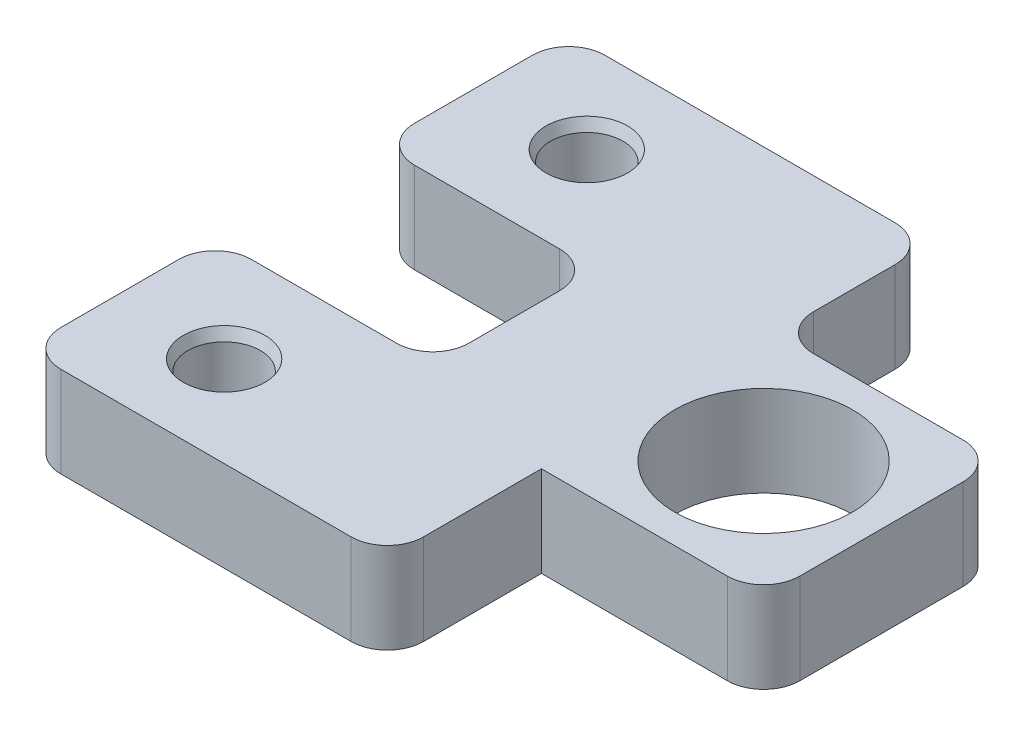
ISO-10303-21;
HEADER;
FILE_DESCRIPTION(('STEP AP214'),'2;1');
FILE_NAME('part.step','',(''),(''),'','','');
FILE_SCHEMA(('AUTOMOTIVE_DESIGN { 1 0 10303 214 1 1 1 1 }'));
ENDSEC;
DATA;
#1=APPLICATION_CONTEXT('core data for automotive mechanical design processes');
#2=APPLICATION_PROTOCOL_DEFINITION('international standard','automotive_design',2000,#1);
#3=PRODUCT_CONTEXT('',#1,'mechanical');
#4=PRODUCT('Part','Part','',(#3));
#5=PRODUCT_RELATED_PRODUCT_CATEGORY('part','',(#4));
#6=PRODUCT_DEFINITION_FORMATION('','',#4);
#7=PRODUCT_DEFINITION_CONTEXT('part definition',#1,'design');
#8=PRODUCT_DEFINITION('design','',#6,#7);
#9=PRODUCT_DEFINITION_SHAPE('','',#8);
#10=(LENGTH_UNIT() NAMED_UNIT(*) SI_UNIT(.MILLI.,.METRE.));
#11=(NAMED_UNIT(*) PLANE_ANGLE_UNIT() SI_UNIT($,.RADIAN.));
#12=(NAMED_UNIT(*) SI_UNIT($,.STERADIAN.) SOLID_ANGLE_UNIT());
#13=UNCERTAINTY_MEASURE_WITH_UNIT(LENGTH_MEASURE(1.E-05),#10,'distance_accuracy_value','');
#14=(GEOMETRIC_REPRESENTATION_CONTEXT(3) GLOBAL_UNCERTAINTY_ASSIGNED_CONTEXT((#13)) GLOBAL_UNIT_ASSIGNED_CONTEXT((#10,
#11,#12)) REPRESENTATION_CONTEXT('',''));
#15=CARTESIAN_POINT('',(0.,0.,0.));
#16=DIRECTION('',(0.,0.,1.));
#17=DIRECTION('',(1.,0.,0.));
#18=AXIS2_PLACEMENT_3D('',#15,#16,#17);
#19=CARTESIAN_POINT('',(10.,5.,0.));
#20=DIRECTION('',(-1.,0.,0.));
#21=DIRECTION('',(0.,0.,1.));
#22=AXIS2_PLACEMENT_3D('',#19,#20,#21);
#23=PLANE('',#22);
#24=DIRECTION('',(0.,0.,-1.));
#25=VECTOR('',#24,1.);
#26=CARTESIAN_POINT('',(10.,5.,0.));
#27=LINE('',#26,#25);
#28=CARTESIAN_POINT('',(10.,5.,13.));
#29=VERTEX_POINT('',#28);
#30=CARTESIAN_POINT('',(10.,5.,6.5));
#31=VERTEX_POINT('',#30);
#32=EDGE_CURVE('E196',#29,#31,#27,.T.);
#33=ORIENTED_EDGE('',*,*,#32,.F.);
#34=DIRECTION('',(0.,-1.,0.));
#35=VECTOR('',#34,1.);
#36=CARTESIAN_POINT('',(10.,5.,13.));
#37=LINE('',#36,#35);
#38=CARTESIAN_POINT('',(10.,0.,13.));
#39=VERTEX_POINT('',#38);
#40=EDGE_CURVE('E312',#29,#39,#37,.T.);
#41=ORIENTED_EDGE('',*,*,#40,.T.);
#42=DIRECTION('',(0.,0.,-1.));
#43=VECTOR('',#42,1.);
#44=CARTESIAN_POINT('',(10.,0.,0.));
#45=LINE('',#44,#43);
#46=CARTESIAN_POINT('',(10.,0.,6.5));
#47=VERTEX_POINT('',#46);
#48=EDGE_CURVE('E222',#39,#47,#45,.T.);
#49=ORIENTED_EDGE('',*,*,#48,.T.);
#50=DIRECTION('',(0.,-1.,0.));
#51=VECTOR('',#50,1.);
#52=CARTESIAN_POINT('',(10.,5.,6.5));
#53=LINE('',#52,#51);
#54=EDGE_CURVE('E216',#31,#47,#53,.T.);
#55=ORIENTED_EDGE('',*,*,#54,.F.);
#56=EDGE_LOOP('',(#33,#41,#49,#55));
#57=FACE_BOUND('',#56,.T.);
#58=ADVANCED_FACE('F41',(#57),#23,.F.);
#59=CARTESIAN_POINT('',(0.,5.,6.5));
#60=DIRECTION('',(0.,0.,-1.));
#61=DIRECTION('',(-1.,0.,0.));
#62=AXIS2_PLACEMENT_3D('',#59,#60,#61);
#63=PLANE('',#62);
#64=DIRECTION('',(1.,0.,0.));
#65=VECTOR('',#64,1.);
#66=CARTESIAN_POINT('',(0.,0.,6.5));
#67=LINE('',#66,#65);
#68=CARTESIAN_POINT('',(20.25,0.,6.5));
#69=VERTEX_POINT('',#68);
#70=EDGE_CURVE('E362',#47,#69,#67,.T.);
#71=ORIENTED_EDGE('',*,*,#70,.T.);
#72=DIRECTION('',(0.,-1.,0.));
#73=VECTOR('',#72,1.);
#74=CARTESIAN_POINT('',(20.25,5.,6.5));
#75=LINE('',#74,#73);
#76=CARTESIAN_POINT('',(20.25,5.,6.5));
#77=VERTEX_POINT('',#76);
#78=EDGE_CURVE('E218',#69,#77,#75,.F.);
#79=ORIENTED_EDGE('',*,*,#78,.T.);
#80=DIRECTION('',(1.,0.,0.));
#81=VECTOR('',#80,1.);
#82=CARTESIAN_POINT('',(0.,5.,6.5));
#83=LINE('',#82,#81);
#84=EDGE_CURVE('E201',#31,#77,#83,.T.);
#85=ORIENTED_EDGE('',*,*,#84,.F.);
#86=ORIENTED_EDGE('',*,*,#54,.T.);
#87=EDGE_LOOP('',(#71,#79,#85,#86));
#88=FACE_BOUND('',#87,.T.);
#89=ADVANCED_FACE('F215',(#88),#63,.F.);
#90=CARTESIAN_POINT('',(22.25,5.,0.));
#91=DIRECTION('',(-1.,0.,0.));
#92=DIRECTION('',(0.,0.,1.));
#93=AXIS2_PLACEMENT_3D('',#90,#91,#92);
#94=PLANE('',#93);
#95=DIRECTION('',(0.,0.,-1.));
#96=VECTOR('',#95,1.);
#97=CARTESIAN_POINT('',(22.25,0.,0.));
#98=LINE('',#97,#96);
#99=CARTESIAN_POINT('',(22.25,0.,4.5));
#100=VERTEX_POINT('',#99);
#101=CARTESIAN_POINT('',(22.25,0.,-4.5));
#102=VERTEX_POINT('',#101);
#103=EDGE_CURVE('E366',#100,#102,#98,.T.);
#104=ORIENTED_EDGE('',*,*,#103,.T.);
#105=DIRECTION('',(0.,-1.,0.));
#106=VECTOR('',#105,1.);
#107=CARTESIAN_POINT('',(22.25,5.,-4.5));
#108=LINE('',#107,#106);
#109=CARTESIAN_POINT('',(22.25,5.,-4.5));
#110=VERTEX_POINT('',#109);
#111=EDGE_CURVE('E309',#102,#110,#108,.F.);
#112=ORIENTED_EDGE('',*,*,#111,.T.);
#113=DIRECTION('',(0.,0.,-1.));
#114=VECTOR('',#113,1.);
#115=CARTESIAN_POINT('',(22.25,5.,0.));
#116=LINE('',#115,#114);
#117=CARTESIAN_POINT('',(22.25,5.,4.5));
#118=VERTEX_POINT('',#117);
#119=EDGE_CURVE('E219',#118,#110,#116,.T.);
#120=ORIENTED_EDGE('',*,*,#119,.F.);
#121=DIRECTION('',(0.,-1.,0.));
#122=VECTOR('',#121,1.);
#123=CARTESIAN_POINT('',(22.25,5.,4.5));
#124=LINE('',#123,#122);
#125=EDGE_CURVE('E306',#118,#100,#124,.T.);
#126=ORIENTED_EDGE('',*,*,#125,.T.);
#127=EDGE_LOOP('',(#104,#112,#120,#126));
#128=FACE_BOUND('',#127,.T.);
#129=ADVANCED_FACE('F414',(#128),#94,.F.);
#130=CARTESIAN_POINT('',(0.,5.,-6.5));
#131=DIRECTION('',(0.,0.,-1.));
#132=DIRECTION('',(-1.,0.,0.));
#133=AXIS2_PLACEMENT_3D('',#130,#131,#132);
#134=PLANE('',#133);
#135=DIRECTION('',(1.,0.,0.));
#136=VECTOR('',#135,1.);
#137=CARTESIAN_POINT('',(0.,0.,-6.5));
#138=LINE('',#137,#136);
#139=CARTESIAN_POINT('',(12.,0.,-6.5));
#140=VERTEX_POINT('',#139);
#141=CARTESIAN_POINT('',(20.25,0.,-6.5));
#142=VERTEX_POINT('',#141);
#143=EDGE_CURVE('E369',#140,#142,#138,.T.);
#144=ORIENTED_EDGE('',*,*,#143,.F.);
#145=DIRECTION('',(0.,-1.,0.));
#146=VECTOR('',#145,1.);
#147=CARTESIAN_POINT('',(12.,5.,-6.5));
#148=LINE('',#147,#146);
#149=CARTESIAN_POINT('',(12.,5.,-6.5));
#150=VERTEX_POINT('',#149);
#151=EDGE_CURVE('E240',#140,#150,#148,.F.);
#152=ORIENTED_EDGE('',*,*,#151,.T.);
#153=DIRECTION('',(1.,0.,0.));
#154=VECTOR('',#153,1.);
#155=CARTESIAN_POINT('',(0.,5.,-6.5));
#156=LINE('',#155,#154);
#157=CARTESIAN_POINT('',(20.25,5.,-6.5));
#158=VERTEX_POINT('',#157);
#159=EDGE_CURVE('E436',#150,#158,#156,.T.);
#160=ORIENTED_EDGE('',*,*,#159,.T.);
#161=DIRECTION('',(0.,-1.,0.));
#162=VECTOR('',#161,1.);
#163=CARTESIAN_POINT('',(20.25,0.,-6.5));
#164=LINE('',#163,#162);
#165=EDGE_CURVE('E237',#158,#142,#164,.T.);
#166=ORIENTED_EDGE('',*,*,#165,.T.);
#167=EDGE_LOOP('',(#144,#152,#160,#166));
#168=FACE_BOUND('',#167,.T.);
#169=ADVANCED_FACE('F420',(#168),#134,.T.);
#170=CARTESIAN_POINT('',(10.,5.,-8.5));
#171=VERTEX_POINT('',#170);
#172=CARTESIAN_POINT('',(10.,5.,-13.));
#173=VERTEX_POINT('',#172);
#174=EDGE_CURVE('E211',#171,#173,#27,.T.);
#175=ORIENTED_EDGE('',*,*,#174,.F.);
#176=DIRECTION('',(0.,-1.,0.));
#177=VECTOR('',#176,1.);
#178=CARTESIAN_POINT('',(10.,5.,-8.5));
#179=LINE('',#178,#177);
#180=CARTESIAN_POINT('',(10.,0.,-8.5));
#181=VERTEX_POINT('',#180);
#182=EDGE_CURVE('E227',#171,#181,#179,.T.);
#183=ORIENTED_EDGE('',*,*,#182,.T.);
#184=CARTESIAN_POINT('',(10.,0.,-13.));
#185=VERTEX_POINT('',#184);
#186=EDGE_CURVE('E364',#181,#185,#45,.T.);
#187=ORIENTED_EDGE('',*,*,#186,.T.);
#188=DIRECTION('',(0.,-1.,0.));
#189=VECTOR('',#188,1.);
#190=CARTESIAN_POINT('',(10.,5.,-13.));
#191=LINE('',#190,#189);
#192=EDGE_CURVE('E224',#185,#173,#191,.F.);
#193=ORIENTED_EDGE('',*,*,#192,.T.);
#194=EDGE_LOOP('',(#175,#183,#187,#193));
#195=FACE_BOUND('',#194,.T.);
#196=ADVANCED_FACE('F409',(#195),#23,.F.);
#197=CARTESIAN_POINT('',(0.,5.,-15.));
#198=DIRECTION('',(0.,0.,-1.));
#199=DIRECTION('',(-1.,0.,0.));
#200=AXIS2_PLACEMENT_3D('',#197,#198,#199);
#201=PLANE('',#200);
#202=DIRECTION('',(1.,0.,0.));
#203=VECTOR('',#202,1.);
#204=CARTESIAN_POINT('',(0.,5.,-15.));
#205=LINE('',#204,#203);
#206=CARTESIAN_POINT('',(-7.99999999999999,5.,-15.));
#207=VERTEX_POINT('',#206);
#208=CARTESIAN_POINT('',(8.00000000000001,5.,-15.));
#209=VERTEX_POINT('',#208);
#210=EDGE_CURVE('E435',#207,#209,#205,.T.);
#211=ORIENTED_EDGE('',*,*,#210,.T.);
#212=DIRECTION('',(0.,-1.,0.));
#213=VECTOR('',#212,1.);
#214=CARTESIAN_POINT('',(8.00000000000001,0.,-15.));
#215=LINE('',#214,#213);
#216=CARTESIAN_POINT('',(8.00000000000001,0.,-15.));
#217=VERTEX_POINT('',#216);
#218=EDGE_CURVE('E244',#209,#217,#215,.T.);
#219=ORIENTED_EDGE('',*,*,#218,.T.);
#220=DIRECTION('',(1.,0.,0.));
#221=VECTOR('',#220,1.);
#222=CARTESIAN_POINT('',(0.,0.,-15.));
#223=LINE('',#222,#221);
#224=CARTESIAN_POINT('',(-7.99999999999999,0.,-15.));
#225=VERTEX_POINT('',#224);
#226=EDGE_CURVE('E372',#225,#217,#223,.T.);
#227=ORIENTED_EDGE('',*,*,#226,.F.);
#228=DIRECTION('',(0.,-1.,0.));
#229=VECTOR('',#228,1.);
#230=CARTESIAN_POINT('',(-7.99999999999999,5.,-15.));
#231=LINE('',#230,#229);
#232=EDGE_CURVE('E242',#225,#207,#231,.F.);
#233=ORIENTED_EDGE('',*,*,#232,.T.);
#234=EDGE_LOOP('',(#211,#219,#227,#233));
#235=FACE_BOUND('',#234,.T.);
#236=ADVANCED_FACE('F419',(#235),#201,.T.);
#237=CARTESIAN_POINT('',(-9.99999999999999,5.,0.));
#238=DIRECTION('',(-1.,0.,0.));
#239=DIRECTION('',(0.,0.,1.));
#240=AXIS2_PLACEMENT_3D('',#237,#238,#239);
#241=PLANE('',#240);
#242=DIRECTION('',(0.,0.,-1.));
#243=VECTOR('',#242,1.);
#244=CARTESIAN_POINT('',(-9.99999999999999,5.,0.));
#245=LINE('',#244,#243);
#246=CARTESIAN_POINT('',(-9.99999999999999,5.,-6.5));
#247=VERTEX_POINT('',#246);
#248=CARTESIAN_POINT('',(-9.99999999999999,5.,-13.));
#249=VERTEX_POINT('',#248);
#250=EDGE_CURVE('E355',#247,#249,#245,.T.);
#251=ORIENTED_EDGE('',*,*,#250,.T.);
#252=DIRECTION('',(0.,-1.,0.));
#253=VECTOR('',#252,1.);
#254=CARTESIAN_POINT('',(-9.99999999999999,5.,-13.));
#255=LINE('',#254,#253);
#256=CARTESIAN_POINT('',(-9.99999999999999,0.,-13.));
#257=VERTEX_POINT('',#256);
#258=EDGE_CURVE('E279',#249,#257,#255,.T.);
#259=ORIENTED_EDGE('',*,*,#258,.T.);
#260=DIRECTION('',(0.,0.,-1.));
#261=VECTOR('',#260,1.);
#262=CARTESIAN_POINT('',(-9.99999999999999,0.,0.));
#263=LINE('',#262,#261);
#264=CARTESIAN_POINT('',(-9.99999999999999,0.,-6.5));
#265=VERTEX_POINT('',#264);
#266=EDGE_CURVE('E374',#265,#257,#263,.T.);
#267=ORIENTED_EDGE('',*,*,#266,.F.);
#268=DIRECTION('',(0.,-1.,0.));
#269=VECTOR('',#268,1.);
#270=CARTESIAN_POINT('',(-9.99999999999999,5.,-6.5));
#271=LINE('',#270,#269);
#272=EDGE_CURVE('E277',#265,#247,#271,.F.);
#273=ORIENTED_EDGE('',*,*,#272,.T.);
#274=EDGE_LOOP('',(#251,#259,#267,#273));
#275=FACE_BOUND('',#274,.T.);
#276=ADVANCED_FACE('F426',(#275),#241,.T.);
#277=CARTESIAN_POINT('',(0.,5.,-4.5));
#278=DIRECTION('',(0.,0.,-1.));
#279=DIRECTION('',(-1.,0.,0.));
#280=AXIS2_PLACEMENT_3D('',#277,#278,#279);
#281=PLANE('',#280);
#282=DIRECTION('',(1.,0.,0.));
#283=VECTOR('',#282,1.);
#284=CARTESIAN_POINT('',(0.,5.,-4.5));
#285=LINE('',#284,#283);
#286=CARTESIAN_POINT('',(-7.99999999999999,5.,-4.5));
#287=VERTEX_POINT('',#286);
#288=CARTESIAN_POINT('',(0.,5.,-4.5));
#289=VERTEX_POINT('',#288);
#290=EDGE_CURVE('E356',#287,#289,#285,.T.);
#291=ORIENTED_EDGE('',*,*,#290,.F.);
#292=DIRECTION('',(0.,-1.,0.));
#293=VECTOR('',#292,1.);
#294=CARTESIAN_POINT('',(-7.99999999999999,0.,-4.5));
#295=LINE('',#294,#293);
#296=CARTESIAN_POINT('',(-7.99999999999999,0.,-4.5));
#297=VERTEX_POINT('',#296);
#298=EDGE_CURVE('E284',#287,#297,#295,.T.);
#299=ORIENTED_EDGE('',*,*,#298,.T.);
#300=DIRECTION('',(1.,0.,0.));
#301=VECTOR('',#300,1.);
#302=CARTESIAN_POINT('',(0.,0.,-4.5));
#303=LINE('',#302,#301);
#304=CARTESIAN_POINT('',(0.,0.,-4.5));
#305=VERTEX_POINT('',#304);
#306=EDGE_CURVE('E339',#297,#305,#303,.T.);
#307=ORIENTED_EDGE('',*,*,#306,.T.);
#308=DIRECTION('',(0.,-1.,0.));
#309=VECTOR('',#308,1.);
#310=CARTESIAN_POINT('',(0.,5.,-4.5));
#311=LINE('',#310,#309);
#312=EDGE_CURVE('E282',#305,#289,#311,.F.);
#313=ORIENTED_EDGE('',*,*,#312,.T.);
#314=EDGE_LOOP('',(#291,#299,#307,#313));
#315=FACE_BOUND('',#314,.T.);
#316=ADVANCED_FACE('F573',(#315),#281,.F.);
#317=CARTESIAN_POINT('',(2.00000000000001,5.,0.));
#318=DIRECTION('',(1.,0.,0.));
#319=DIRECTION('',(0.,0.,-1.));
#320=AXIS2_PLACEMENT_3D('',#317,#318,#319);
#321=PLANE('',#320);
#322=DIRECTION('',(0.,0.,1.));
#323=VECTOR('',#322,1.);
#324=CARTESIAN_POINT('',(2.00000000000001,5.,0.));
#325=LINE('',#324,#323);
#326=CARTESIAN_POINT('',(2.00000000000001,5.,-2.5));
#327=VERTEX_POINT('',#326);
#328=CARTESIAN_POINT('',(2.00000000000001,5.,2.5));
#329=VERTEX_POINT('',#328);
#330=EDGE_CURVE('E347',#327,#329,#325,.T.);
#331=ORIENTED_EDGE('',*,*,#330,.F.);
#332=DIRECTION('',(0.,-1.,0.));
#333=VECTOR('',#332,1.);
#334=CARTESIAN_POINT('',(2.00000000000001,0.,-2.5));
#335=LINE('',#334,#333);
#336=CARTESIAN_POINT('',(2.00000000000001,0.,-2.5));
#337=VERTEX_POINT('',#336);
#338=EDGE_CURVE('E289',#327,#337,#335,.T.);
#339=ORIENTED_EDGE('',*,*,#338,.T.);
#340=DIRECTION('',(0.,0.,1.));
#341=VECTOR('',#340,1.);
#342=CARTESIAN_POINT('',(2.00000000000001,0.,0.));
#343=LINE('',#342,#341);
#344=CARTESIAN_POINT('',(2.00000000000001,0.,2.5));
#345=VERTEX_POINT('',#344);
#346=EDGE_CURVE('E328',#337,#345,#343,.T.);
#347=ORIENTED_EDGE('',*,*,#346,.T.);
#348=DIRECTION('',(0.,-1.,0.));
#349=VECTOR('',#348,1.);
#350=CARTESIAN_POINT('',(2.00000000000001,5.,2.5));
#351=LINE('',#350,#349);
#352=EDGE_CURVE('E287',#345,#329,#351,.F.);
#353=ORIENTED_EDGE('',*,*,#352,.T.);
#354=EDGE_LOOP('',(#331,#339,#347,#353));
#355=FACE_BOUND('',#354,.T.);
#356=ADVANCED_FACE('F336',(#355),#321,.F.);
#357=CARTESIAN_POINT('',(0.,5.,4.5));
#358=DIRECTION('',(0.,0.,1.));
#359=DIRECTION('',(1.,0.,0.));
#360=AXIS2_PLACEMENT_3D('',#357,#358,#359);
#361=PLANE('',#360);
#362=DIRECTION('',(-1.,0.,0.));
#363=VECTOR('',#362,1.);
#364=CARTESIAN_POINT('',(0.,5.,4.5));
#365=LINE('',#364,#363);
#366=CARTESIAN_POINT('',(0.,5.,4.5));
#367=VERTEX_POINT('',#366);
#368=CARTESIAN_POINT('',(-7.99999999999999,5.,4.5));
#369=VERTEX_POINT('',#368);
#370=EDGE_CURVE('E345',#367,#369,#365,.T.);
#371=ORIENTED_EDGE('',*,*,#370,.F.);
#372=DIRECTION('',(0.,-1.,0.));
#373=VECTOR('',#372,1.);
#374=CARTESIAN_POINT('',(0.,0.,4.5));
#375=LINE('',#374,#373);
#376=CARTESIAN_POINT('',(0.,0.,4.5));
#377=VERTEX_POINT('',#376);
#378=EDGE_CURVE('E294',#367,#377,#375,.T.);
#379=ORIENTED_EDGE('',*,*,#378,.T.);
#380=DIRECTION('',(-1.,0.,0.));
#381=VECTOR('',#380,1.);
#382=CARTESIAN_POINT('',(0.,0.,4.5));
#383=LINE('',#382,#381);
#384=CARTESIAN_POINT('',(-7.99999999999999,0.,4.5));
#385=VERTEX_POINT('',#384);
#386=EDGE_CURVE('E330',#377,#385,#383,.T.);
#387=ORIENTED_EDGE('',*,*,#386,.T.);
#388=DIRECTION('',(0.,-1.,0.));
#389=VECTOR('',#388,1.);
#390=CARTESIAN_POINT('',(-7.99999999999999,5.,4.5));
#391=LINE('',#390,#389);
#392=EDGE_CURVE('E292',#385,#369,#391,.F.);
#393=ORIENTED_EDGE('',*,*,#392,.T.);
#394=EDGE_LOOP('',(#371,#379,#387,#393));
#395=FACE_BOUND('',#394,.T.);
#396=ADVANCED_FACE('F349',(#395),#361,.F.);
#397=CARTESIAN_POINT('',(-9.99999999999999,5.,13.));
#398=VERTEX_POINT('',#397);
#399=CARTESIAN_POINT('',(-9.99999999999999,5.,6.5));
#400=VERTEX_POINT('',#399);
#401=EDGE_CURVE('E351',#398,#400,#245,.T.);
#402=ORIENTED_EDGE('',*,*,#401,.T.);
#403=DIRECTION('',(0.,-1.,0.));
#404=VECTOR('',#403,1.);
#405=CARTESIAN_POINT('',(-9.99999999999999,0.,6.5));
#406=LINE('',#405,#404);
#407=CARTESIAN_POINT('',(-9.99999999999999,0.,6.5));
#408=VERTEX_POINT('',#407);
#409=EDGE_CURVE('E299',#400,#408,#406,.T.);
#410=ORIENTED_EDGE('',*,*,#409,.T.);
#411=CARTESIAN_POINT('',(-9.99999999999999,0.,13.));
#412=VERTEX_POINT('',#411);
#413=EDGE_CURVE('E377',#412,#408,#263,.T.);
#414=ORIENTED_EDGE('',*,*,#413,.F.);
#415=DIRECTION('',(0.,-1.,0.));
#416=VECTOR('',#415,1.);
#417=CARTESIAN_POINT('',(-9.99999999999999,5.,13.));
#418=LINE('',#417,#416);
#419=EDGE_CURVE('E297',#412,#398,#418,.F.);
#420=ORIENTED_EDGE('',*,*,#419,.T.);
#421=EDGE_LOOP('',(#402,#410,#414,#420));
#422=FACE_BOUND('',#421,.T.);
#423=ADVANCED_FACE('F387',(#422),#241,.T.);
#424=CARTESIAN_POINT('',(0.,5.,15.));
#425=DIRECTION('',(0.,0.,-1.));
#426=DIRECTION('',(-1.,0.,0.));
#427=AXIS2_PLACEMENT_3D('',#424,#425,#426);
#428=PLANE('',#427);
#429=DIRECTION('',(1.,0.,0.));
#430=VECTOR('',#429,1.);
#431=CARTESIAN_POINT('',(0.,5.,15.));
#432=LINE('',#431,#430);
#433=CARTESIAN_POINT('',(-7.99999999999999,5.,15.));
#434=VERTEX_POINT('',#433);
#435=CARTESIAN_POINT('',(8.00000000000001,5.,15.));
#436=VERTEX_POINT('',#435);
#437=EDGE_CURVE('E230',#434,#436,#432,.T.);
#438=ORIENTED_EDGE('',*,*,#437,.F.);
#439=DIRECTION('',(0.,-1.,0.));
#440=VECTOR('',#439,1.);
#441=CARTESIAN_POINT('',(-7.99999999999999,0.,15.));
#442=LINE('',#441,#440);
#443=CARTESIAN_POINT('',(-7.99999999999999,0.,15.));
#444=VERTEX_POINT('',#443);
#445=EDGE_CURVE('E303',#434,#444,#442,.T.);
#446=ORIENTED_EDGE('',*,*,#445,.T.);
#447=DIRECTION('',(1.,0.,0.));
#448=VECTOR('',#447,1.);
#449=CARTESIAN_POINT('',(0.,0.,15.));
#450=LINE('',#449,#448);
#451=CARTESIAN_POINT('',(8.00000000000001,0.,15.));
#452=VERTEX_POINT('',#451);
#453=EDGE_CURVE('E380',#444,#452,#450,.T.);
#454=ORIENTED_EDGE('',*,*,#453,.T.);
#455=DIRECTION('',(0.,-1.,0.));
#456=VECTOR('',#455,1.);
#457=CARTESIAN_POINT('',(8.00000000000001,5.,15.));
#458=LINE('',#457,#456);
#459=EDGE_CURVE('E56',#452,#436,#458,.F.);
#460=ORIENTED_EDGE('',*,*,#459,.T.);
#461=EDGE_LOOP('',(#438,#446,#454,#460));
#462=FACE_BOUND('',#461,.T.);
#463=ADVANCED_FACE('F392',(#462),#428,.F.);
#464=CARTESIAN_POINT('',(15.75,5.,0.));
#465=DIRECTION('',(0.,-1.,0.));
#466=DIRECTION('',(0.,0.,-1.));
#467=AXIS2_PLACEMENT_3D('',#464,#465,#466);
#468=CYLINDRICAL_SURFACE('',#467,4.9);
#469=CARTESIAN_POINT('',(15.75,5.,0.));
#470=DIRECTION('',(0.,1.,0.));
#471=DIRECTION('',(0.,0.,1.));
#472=AXIS2_PLACEMENT_3D('',#469,#470,#471);
#473=CIRCLE('',#472,4.9);
#474=CARTESIAN_POINT('',(15.75,5.,4.9));
#475=VERTEX_POINT('',#474);
#476=EDGE_CURVE('E225',#475,#475,#473,.T.);
#477=ORIENTED_EDGE('',*,*,#476,.T.);
#478=EDGE_LOOP('',(#477));
#479=FACE_BOUND('',#478,.T.);
#480=CARTESIAN_POINT('',(15.75,0.,0.));
#481=DIRECTION('',(0.,1.,0.));
#482=DIRECTION('',(0.,0.,1.));
#483=AXIS2_PLACEMENT_3D('',#480,#481,#482);
#484=CIRCLE('',#483,4.9);
#485=CARTESIAN_POINT('',(15.75,0.,4.9));
#486=VERTEX_POINT('',#485);
#487=EDGE_CURVE('E209',#486,#486,#484,.T.);
#488=ORIENTED_EDGE('',*,*,#487,.F.);
#489=EDGE_LOOP('',(#488));
#490=FACE_BOUND('',#489,.T.);
#491=ADVANCED_FACE('F559',(#479,#490),#468,.F.);
#492=CARTESIAN_POINT('',(0.,5.,0.));
#493=DIRECTION('',(0.,1.,0.));
#494=DIRECTION('',(0.,0.,1.));
#495=AXIS2_PLACEMENT_3D('',#492,#493,#494);
#496=PLANE('',#495);
#497=CARTESIAN_POINT('',(-4.,5.,10.));
#498=DIRECTION('',(0.,1.,0.));
#499=DIRECTION('',(0.,0.,1.));
#500=AXIS2_PLACEMENT_3D('',#497,#498,#499);
#501=CIRCLE('',#500,2.25);
#502=CARTESIAN_POINT('',(-4.,5.,12.25));
#503=VERTEX_POINT('',#502);
#504=EDGE_CURVE('E740',#503,#503,#501,.T.);
#505=ORIENTED_EDGE('',*,*,#504,.F.);
#506=EDGE_LOOP('',(#505));
#507=FACE_BOUND('',#506,.T.);
#508=CARTESIAN_POINT('',(-4.00000000000001,5.,-10.));
#509=DIRECTION('',(0.,1.,0.));
#510=DIRECTION('',(0.,0.,1.));
#511=AXIS2_PLACEMENT_3D('',#508,#509,#510);
#512=CIRCLE('',#511,2.25);
#513=CARTESIAN_POINT('',(-4.00000000000001,5.,-7.75));
#514=VERTEX_POINT('',#513);
#515=EDGE_CURVE('E731',#514,#514,#512,.T.);
#516=ORIENTED_EDGE('',*,*,#515,.F.);
#517=EDGE_LOOP('',(#516));
#518=FACE_BOUND('',#517,.T.);
#519=ORIENTED_EDGE('',*,*,#174,.T.);
#520=CARTESIAN_POINT('',(8.00000000000001,5.,-13.));
#521=DIRECTION('',(0.,1.,0.));
#522=DIRECTION('',(0.,0.,1.));
#523=AXIS2_PLACEMENT_3D('',#520,#521,#522);
#524=CIRCLE('',#523,2.);
#525=EDGE_CURVE('E275',#173,#209,#524,.T.);
#526=ORIENTED_EDGE('',*,*,#525,.T.);
#527=ORIENTED_EDGE('',*,*,#210,.F.);
#528=CARTESIAN_POINT('',(-7.99999999999999,5.,-13.));
#529=DIRECTION('',(0.,1.,0.));
#530=DIRECTION('',(0.,0.,1.));
#531=AXIS2_PLACEMENT_3D('',#528,#529,#530);
#532=CIRCLE('',#531,2.);
#533=EDGE_CURVE('E273',#207,#249,#532,.T.);
#534=ORIENTED_EDGE('',*,*,#533,.T.);
#535=ORIENTED_EDGE('',*,*,#250,.F.);
#536=CARTESIAN_POINT('',(-7.99999999999999,5.,-6.5));
#537=DIRECTION('',(0.,1.,0.));
#538=DIRECTION('',(0.,0.,1.));
#539=AXIS2_PLACEMENT_3D('',#536,#537,#538);
#540=CIRCLE('',#539,2.);
#541=EDGE_CURVE('E271',#247,#287,#540,.T.);
#542=ORIENTED_EDGE('',*,*,#541,.T.);
#543=ORIENTED_EDGE('',*,*,#290,.T.);
#544=CARTESIAN_POINT('',(0.,5.,-2.5));
#545=DIRECTION('',(0.,1.,0.));
#546=DIRECTION('',(0.,0.,1.));
#547=AXIS2_PLACEMENT_3D('',#544,#545,#546);
#548=CIRCLE('',#547,2.);
#549=EDGE_CURVE('E320',#289,#327,#548,.F.);
#550=ORIENTED_EDGE('',*,*,#549,.T.);
#551=ORIENTED_EDGE('',*,*,#330,.T.);
#552=CARTESIAN_POINT('',(0.,5.,2.5));
#553=DIRECTION('',(0.,1.,0.));
#554=DIRECTION('',(0.,0.,1.));
#555=AXIS2_PLACEMENT_3D('',#552,#553,#554);
#556=CIRCLE('',#555,2.);
#557=EDGE_CURVE('E11',#329,#367,#556,.F.);
#558=ORIENTED_EDGE('',*,*,#557,.T.);
#559=ORIENTED_EDGE('',*,*,#370,.T.);
#560=CARTESIAN_POINT('',(-7.99999999999999,5.,6.5));
#561=DIRECTION('',(0.,1.,0.));
#562=DIRECTION('',(0.,0.,1.));
#563=AXIS2_PLACEMENT_3D('',#560,#561,#562);
#564=CIRCLE('',#563,2.);
#565=EDGE_CURVE('E269',#369,#400,#564,.T.);
#566=ORIENTED_EDGE('',*,*,#565,.T.);
#567=ORIENTED_EDGE('',*,*,#401,.F.);
#568=CARTESIAN_POINT('',(-7.99999999999999,5.,13.));
#569=DIRECTION('',(0.,1.,0.));
#570=DIRECTION('',(0.,0.,1.));
#571=AXIS2_PLACEMENT_3D('',#568,#569,#570);
#572=CIRCLE('',#571,2.);
#573=EDGE_CURVE('E63',#398,#434,#572,.T.);
#574=ORIENTED_EDGE('',*,*,#573,.T.);
#575=ORIENTED_EDGE('',*,*,#437,.T.);
#576=CARTESIAN_POINT('',(8.00000000000001,5.,13.));
#577=DIRECTION('',(0.,1.,0.));
#578=DIRECTION('',(0.,0.,1.));
#579=AXIS2_PLACEMENT_3D('',#576,#577,#578);
#580=CIRCLE('',#579,2.);
#581=EDGE_CURVE('E204',#436,#29,#580,.T.);
#582=ORIENTED_EDGE('',*,*,#581,.T.);
#583=ORIENTED_EDGE('',*,*,#32,.T.);
#584=ORIENTED_EDGE('',*,*,#84,.T.);
#585=CARTESIAN_POINT('',(20.25,5.,4.5));
#586=DIRECTION('',(0.,1.,0.));
#587=DIRECTION('',(0.,0.,1.));
#588=AXIS2_PLACEMENT_3D('',#585,#586,#587);
#589=CIRCLE('',#588,2.);
#590=EDGE_CURVE('E264',#77,#118,#589,.T.);
#591=ORIENTED_EDGE('',*,*,#590,.T.);
#592=ORIENTED_EDGE('',*,*,#119,.T.);
#593=CARTESIAN_POINT('',(20.25,5.,-4.5));
#594=DIRECTION('',(0.,1.,0.));
#595=DIRECTION('',(0.,0.,1.));
#596=AXIS2_PLACEMENT_3D('',#593,#594,#595);
#597=CIRCLE('',#596,2.);
#598=EDGE_CURVE('E266',#110,#158,#597,.T.);
#599=ORIENTED_EDGE('',*,*,#598,.T.);
#600=ORIENTED_EDGE('',*,*,#159,.F.);
#601=CARTESIAN_POINT('',(12.,5.,-8.5));
#602=DIRECTION('',(0.,1.,0.));
#603=DIRECTION('',(0.,0.,1.));
#604=AXIS2_PLACEMENT_3D('',#601,#602,#603);
#605=CIRCLE('',#604,2.);
#606=EDGE_CURVE('E316',#150,#171,#605,.F.);
#607=ORIENTED_EDGE('',*,*,#606,.T.);
#608=EDGE_LOOP('',(#519,#526,#527,#534,#535,#542,#543,#550,#551,#558,#559,#566,#567,#574,#575,
#582,#583,#584,#591,#592,#599,#600,#607));
#609=FACE_BOUND('',#608,.T.);
#610=ORIENTED_EDGE('',*,*,#476,.F.);
#611=EDGE_LOOP('',(#610));
#612=FACE_BOUND('',#611,.T.);
#613=ADVANCED_FACE('F199',(#507,#518,#609,#612),#496,.T.);
#614=CARTESIAN_POINT('',(0.,0.,0.));
#615=DIRECTION('',(0.,1.,0.));
#616=DIRECTION('',(0.,0.,1.));
#617=AXIS2_PLACEMENT_3D('',#614,#615,#616);
#618=PLANE('',#617);
#619=CARTESIAN_POINT('',(-4.,0.,10.));
#620=DIRECTION('',(0.,1.,0.));
#621=DIRECTION('',(0.,0.,1.));
#622=AXIS2_PLACEMENT_3D('',#619,#620,#621);
#623=CIRCLE('',#622,2.);
#624=CARTESIAN_POINT('',(-4.,0.,12.));
#625=VERTEX_POINT('',#624);
#626=EDGE_CURVE('E725',#625,#625,#623,.T.);
#627=ORIENTED_EDGE('',*,*,#626,.T.);
#628=EDGE_LOOP('',(#627));
#629=FACE_BOUND('',#628,.T.);
#630=CARTESIAN_POINT('',(-4.00000000000001,0.,-10.));
#631=DIRECTION('',(0.,1.,0.));
#632=DIRECTION('',(0.,0.,1.));
#633=AXIS2_PLACEMENT_3D('',#630,#631,#632);
#634=CIRCLE('',#633,2.);
#635=CARTESIAN_POINT('',(-4.00000000000001,0.,-8.));
#636=VERTEX_POINT('',#635);
#637=EDGE_CURVE('E363',#636,#636,#634,.T.);
#638=ORIENTED_EDGE('',*,*,#637,.T.);
#639=EDGE_LOOP('',(#638));
#640=FACE_BOUND('',#639,.T.);
#641=ORIENTED_EDGE('',*,*,#226,.T.);
#642=CARTESIAN_POINT('',(8.00000000000001,0.,-13.));
#643=DIRECTION('',(0.,1.,0.));
#644=DIRECTION('',(0.,0.,1.));
#645=AXIS2_PLACEMENT_3D('',#642,#643,#644);
#646=CIRCLE('',#645,2.);
#647=EDGE_CURVE('E261',#217,#185,#646,.F.);
#648=ORIENTED_EDGE('',*,*,#647,.T.);
#649=ORIENTED_EDGE('',*,*,#186,.F.);
#650=CARTESIAN_POINT('',(12.,0.,-8.5));
#651=DIRECTION('',(0.,1.,0.));
#652=DIRECTION('',(0.,0.,1.));
#653=AXIS2_PLACEMENT_3D('',#650,#651,#652);
#654=CIRCLE('',#653,2.);
#655=EDGE_CURVE('E314',#181,#140,#654,.T.);
#656=ORIENTED_EDGE('',*,*,#655,.T.);
#657=ORIENTED_EDGE('',*,*,#143,.T.);
#658=CARTESIAN_POINT('',(20.25,0.,-4.5));
#659=DIRECTION('',(0.,1.,0.));
#660=DIRECTION('',(0.,0.,1.));
#661=AXIS2_PLACEMENT_3D('',#658,#659,#660);
#662=CIRCLE('',#661,2.);
#663=EDGE_CURVE('E251',#142,#102,#662,.F.);
#664=ORIENTED_EDGE('',*,*,#663,.T.);
#665=ORIENTED_EDGE('',*,*,#103,.F.);
#666=CARTESIAN_POINT('',(20.25,0.,4.5));
#667=DIRECTION('',(0.,1.,0.));
#668=DIRECTION('',(0.,0.,1.));
#669=AXIS2_PLACEMENT_3D('',#666,#667,#668);
#670=CIRCLE('',#669,2.);
#671=EDGE_CURVE('E249',#100,#69,#670,.F.);
#672=ORIENTED_EDGE('',*,*,#671,.T.);
#673=ORIENTED_EDGE('',*,*,#70,.F.);
#674=ORIENTED_EDGE('',*,*,#48,.F.);
#675=CARTESIAN_POINT('',(8.00000000000001,0.,13.));
#676=DIRECTION('',(0.,1.,0.));
#677=DIRECTION('',(0.,0.,1.));
#678=AXIS2_PLACEMENT_3D('',#675,#676,#677);
#679=CIRCLE('',#678,2.);
#680=EDGE_CURVE('E247',#39,#452,#679,.F.);
#681=ORIENTED_EDGE('',*,*,#680,.T.);
#682=ORIENTED_EDGE('',*,*,#453,.F.);
#683=CARTESIAN_POINT('',(-7.99999999999999,0.,13.));
#684=DIRECTION('',(0.,1.,0.));
#685=DIRECTION('',(0.,0.,1.));
#686=AXIS2_PLACEMENT_3D('',#683,#684,#685);
#687=CIRCLE('',#686,2.);
#688=EDGE_CURVE('E253',#444,#412,#687,.F.);
#689=ORIENTED_EDGE('',*,*,#688,.T.);
#690=ORIENTED_EDGE('',*,*,#413,.T.);
#691=CARTESIAN_POINT('',(-7.99999999999999,0.,6.5));
#692=DIRECTION('',(0.,1.,0.));
#693=DIRECTION('',(0.,0.,1.));
#694=AXIS2_PLACEMENT_3D('',#691,#692,#693);
#695=CIRCLE('',#694,2.);
#696=EDGE_CURVE('E255',#408,#385,#695,.F.);
#697=ORIENTED_EDGE('',*,*,#696,.T.);
#698=ORIENTED_EDGE('',*,*,#386,.F.);
#699=CARTESIAN_POINT('',(0.,0.,2.5));
#700=DIRECTION('',(0.,1.,0.));
#701=DIRECTION('',(0.,0.,1.));
#702=AXIS2_PLACEMENT_3D('',#699,#700,#701);
#703=CIRCLE('',#702,2.);
#704=EDGE_CURVE('E49',#377,#345,#703,.T.);
#705=ORIENTED_EDGE('',*,*,#704,.T.);
#706=ORIENTED_EDGE('',*,*,#346,.F.);
#707=CARTESIAN_POINT('',(0.,0.,-2.5));
#708=DIRECTION('',(0.,1.,0.));
#709=DIRECTION('',(0.,0.,1.));
#710=AXIS2_PLACEMENT_3D('',#707,#708,#709);
#711=CIRCLE('',#710,2.);
#712=EDGE_CURVE('E318',#337,#305,#711,.T.);
#713=ORIENTED_EDGE('',*,*,#712,.T.);
#714=ORIENTED_EDGE('',*,*,#306,.F.);
#715=CARTESIAN_POINT('',(-7.99999999999999,0.,-6.5));
#716=DIRECTION('',(0.,1.,0.));
#717=DIRECTION('',(0.,0.,1.));
#718=AXIS2_PLACEMENT_3D('',#715,#716,#717);
#719=CIRCLE('',#718,2.);
#720=EDGE_CURVE('E257',#297,#265,#719,.F.);
#721=ORIENTED_EDGE('',*,*,#720,.T.);
#722=ORIENTED_EDGE('',*,*,#266,.T.);
#723=CARTESIAN_POINT('',(-7.99999999999999,0.,-13.));
#724=DIRECTION('',(0.,1.,0.));
#725=DIRECTION('',(0.,0.,1.));
#726=AXIS2_PLACEMENT_3D('',#723,#724,#725);
#727=CIRCLE('',#726,2.);
#728=EDGE_CURVE('E259',#257,#225,#727,.F.);
#729=ORIENTED_EDGE('',*,*,#728,.T.);
#730=EDGE_LOOP('',(#641,#648,#649,#656,#657,#664,#665,#672,#673,#674,#681,#682,#689,#690,#697,
#698,#705,#706,#713,#714,#721,#722,#729));
#731=FACE_BOUND('',#730,.T.);
#732=ORIENTED_EDGE('',*,*,#487,.T.);
#733=EDGE_LOOP('',(#732));
#734=FACE_BOUND('',#733,.T.);
#735=ADVANCED_FACE('F326',(#629,#640,#731,#734),#618,.F.);
#736=CARTESIAN_POINT('',(12.,5.,-8.5));
#737=DIRECTION('',(0.,-1.,0.));
#738=DIRECTION('',(0.,0.,-1.));
#739=AXIS2_PLACEMENT_3D('',#736,#737,#738);
#740=CYLINDRICAL_SURFACE('',#739,2.);
#741=ORIENTED_EDGE('',*,*,#606,.F.);
#742=ORIENTED_EDGE('',*,*,#151,.F.);
#743=ORIENTED_EDGE('',*,*,#655,.F.);
#744=ORIENTED_EDGE('',*,*,#182,.F.);
#745=EDGE_LOOP('',(#741,#742,#743,#744));
#746=FACE_BOUND('',#745,.T.);
#747=ADVANCED_FACE('F439',(#746),#740,.F.);
#748=CARTESIAN_POINT('',(8.00000000000001,5.,-13.));
#749=DIRECTION('',(0.,1.,0.));
#750=DIRECTION('',(0.,0.,1.));
#751=AXIS2_PLACEMENT_3D('',#748,#749,#750);
#752=CYLINDRICAL_SURFACE('',#751,2.);
#753=ORIENTED_EDGE('',*,*,#525,.F.);
#754=ORIENTED_EDGE('',*,*,#192,.F.);
#755=ORIENTED_EDGE('',*,*,#647,.F.);
#756=ORIENTED_EDGE('',*,*,#218,.F.);
#757=EDGE_LOOP('',(#753,#754,#755,#756));
#758=FACE_BOUND('',#757,.T.);
#759=ADVANCED_FACE('F475',(#758),#752,.T.);
#760=CARTESIAN_POINT('',(-7.99999999999999,5.,-13.));
#761=DIRECTION('',(0.,-1.,0.));
#762=DIRECTION('',(0.,0.,-1.));
#763=AXIS2_PLACEMENT_3D('',#760,#761,#762);
#764=CYLINDRICAL_SURFACE('',#763,2.);
#765=ORIENTED_EDGE('',*,*,#533,.F.);
#766=ORIENTED_EDGE('',*,*,#232,.F.);
#767=ORIENTED_EDGE('',*,*,#728,.F.);
#768=ORIENTED_EDGE('',*,*,#258,.F.);
#769=EDGE_LOOP('',(#765,#766,#767,#768));
#770=FACE_BOUND('',#769,.T.);
#771=ADVANCED_FACE('F469',(#770),#764,.T.);
#772=CARTESIAN_POINT('',(-7.99999999999999,5.,-6.5));
#773=DIRECTION('',(0.,1.,0.));
#774=DIRECTION('',(0.,0.,1.));
#775=AXIS2_PLACEMENT_3D('',#772,#773,#774);
#776=CYLINDRICAL_SURFACE('',#775,2.);
#777=ORIENTED_EDGE('',*,*,#541,.F.);
#778=ORIENTED_EDGE('',*,*,#272,.F.);
#779=ORIENTED_EDGE('',*,*,#720,.F.);
#780=ORIENTED_EDGE('',*,*,#298,.F.);
#781=EDGE_LOOP('',(#777,#778,#779,#780));
#782=FACE_BOUND('',#781,.T.);
#783=ADVANCED_FACE('F482',(#782),#776,.T.);
#784=CARTESIAN_POINT('',(0.,5.,-2.5));
#785=DIRECTION('',(0.,1.,0.));
#786=DIRECTION('',(0.,0.,1.));
#787=AXIS2_PLACEMENT_3D('',#784,#785,#786);
#788=CYLINDRICAL_SURFACE('',#787,2.);
#789=ORIENTED_EDGE('',*,*,#549,.F.);
#790=ORIENTED_EDGE('',*,*,#312,.F.);
#791=ORIENTED_EDGE('',*,*,#712,.F.);
#792=ORIENTED_EDGE('',*,*,#338,.F.);
#793=EDGE_LOOP('',(#789,#790,#791,#792));
#794=FACE_BOUND('',#793,.T.);
#795=ADVANCED_FACE('F488',(#794),#788,.F.);
#796=CARTESIAN_POINT('',(0.,5.,2.5));
#797=DIRECTION('',(0.,1.,0.));
#798=DIRECTION('',(0.,0.,1.));
#799=AXIS2_PLACEMENT_3D('',#796,#797,#798);
#800=CYLINDRICAL_SURFACE('',#799,2.);
#801=ORIENTED_EDGE('',*,*,#557,.F.);
#802=ORIENTED_EDGE('',*,*,#352,.F.);
#803=ORIENTED_EDGE('',*,*,#704,.F.);
#804=ORIENTED_EDGE('',*,*,#378,.F.);
#805=EDGE_LOOP('',(#801,#802,#803,#804));
#806=FACE_BOUND('',#805,.T.);
#807=ADVANCED_FACE('F342',(#806),#800,.F.);
#808=CARTESIAN_POINT('',(-7.99999999999999,5.,6.5));
#809=DIRECTION('',(0.,1.,0.));
#810=DIRECTION('',(0.,0.,1.));
#811=AXIS2_PLACEMENT_3D('',#808,#809,#810);
#812=CYLINDRICAL_SURFACE('',#811,2.);
#813=ORIENTED_EDGE('',*,*,#565,.F.);
#814=ORIENTED_EDGE('',*,*,#392,.F.);
#815=ORIENTED_EDGE('',*,*,#696,.F.);
#816=ORIENTED_EDGE('',*,*,#409,.F.);
#817=EDGE_LOOP('',(#813,#814,#815,#816));
#818=FACE_BOUND('',#817,.T.);
#819=ADVANCED_FACE('F495',(#818),#812,.T.);
#820=CARTESIAN_POINT('',(-7.99999999999999,5.,13.));
#821=DIRECTION('',(0.,1.,0.));
#822=DIRECTION('',(0.,0.,1.));
#823=AXIS2_PLACEMENT_3D('',#820,#821,#822);
#824=CYLINDRICAL_SURFACE('',#823,2.);
#825=ORIENTED_EDGE('',*,*,#573,.F.);
#826=ORIENTED_EDGE('',*,*,#419,.F.);
#827=ORIENTED_EDGE('',*,*,#688,.F.);
#828=ORIENTED_EDGE('',*,*,#445,.F.);
#829=EDGE_LOOP('',(#825,#826,#827,#828));
#830=FACE_BOUND('',#829,.T.);
#831=ADVANCED_FACE('F390',(#830),#824,.T.);
#832=CARTESIAN_POINT('',(20.25,5.,-4.5));
#833=DIRECTION('',(0.,1.,0.));
#834=DIRECTION('',(0.,0.,1.));
#835=AXIS2_PLACEMENT_3D('',#832,#833,#834);
#836=CYLINDRICAL_SURFACE('',#835,2.);
#837=ORIENTED_EDGE('',*,*,#598,.F.);
#838=ORIENTED_EDGE('',*,*,#111,.F.);
#839=ORIENTED_EDGE('',*,*,#663,.F.);
#840=ORIENTED_EDGE('',*,*,#165,.F.);
#841=EDGE_LOOP('',(#837,#838,#839,#840));
#842=FACE_BOUND('',#841,.T.);
#843=ADVANCED_FACE('F405',(#842),#836,.T.);
#844=CARTESIAN_POINT('',(20.25,5.,4.5));
#845=DIRECTION('',(0.,-1.,0.));
#846=DIRECTION('',(0.,0.,-1.));
#847=AXIS2_PLACEMENT_3D('',#844,#845,#846);
#848=CYLINDRICAL_SURFACE('',#847,2.);
#849=ORIENTED_EDGE('',*,*,#590,.F.);
#850=ORIENTED_EDGE('',*,*,#78,.F.);
#851=ORIENTED_EDGE('',*,*,#671,.F.);
#852=ORIENTED_EDGE('',*,*,#125,.F.);
#853=EDGE_LOOP('',(#849,#850,#851,#852));
#854=FACE_BOUND('',#853,.T.);
#855=ADVANCED_FACE('F396',(#854),#848,.T.);
#856=CARTESIAN_POINT('',(8.00000000000001,5.,13.));
#857=DIRECTION('',(0.,-1.,0.));
#858=DIRECTION('',(0.,0.,-1.));
#859=AXIS2_PLACEMENT_3D('',#856,#857,#858);
#860=CYLINDRICAL_SURFACE('',#859,2.);
#861=ORIENTED_EDGE('',*,*,#581,.F.);
#862=ORIENTED_EDGE('',*,*,#459,.F.);
#863=ORIENTED_EDGE('',*,*,#680,.F.);
#864=ORIENTED_EDGE('',*,*,#40,.F.);
#865=EDGE_LOOP('',(#861,#862,#863,#864));
#866=FACE_BOUND('',#865,.T.);
#867=ADVANCED_FACE('F43',(#866),#860,.T.);
#868=CARTESIAN_POINT('',(-4.00000000000001,5.,-10.));
#869=DIRECTION('',(0.,1.,0.));
#870=DIRECTION('',(0.,0.,1.));
#871=AXIS2_PLACEMENT_3D('',#868,#869,#870);
#872=CYLINDRICAL_SURFACE('',#871,2.);
#873=ORIENTED_EDGE('',*,*,#637,.F.);
#874=EDGE_LOOP('',(#873));
#875=FACE_BOUND('',#874,.T.);
#876=CARTESIAN_POINT('',(-4.00000000000001,4.39644660940672,-10.));
#877=DIRECTION('',(0.,1.,0.));
#878=DIRECTION('',(0.,0.,1.));
#879=AXIS2_PLACEMENT_3D('',#876,#877,#878);
#880=CIRCLE('',#879,2.);
#881=CARTESIAN_POINT('',(-4.00000000000001,4.39644660940672,-8.));
#882=VERTEX_POINT('',#881);
#883=EDGE_CURVE('E728',#882,#882,#880,.T.);
#884=ORIENTED_EDGE('',*,*,#883,.T.);
#885=EDGE_LOOP('',(#884));
#886=FACE_BOUND('',#885,.T.);
#887=ADVANCED_FACE('F395',(#875,#886),#872,.F.);
#888=CARTESIAN_POINT('',(-4.00000000000001,5.,-10.));
#889=DIRECTION('',(0.,1.,0.));
#890=DIRECTION('',(0.,0.,1.));
#891=AXIS2_PLACEMENT_3D('',#888,#889,#890);
#892=CONICAL_SURFACE('',#891,2.25,0.392699081698722);
#893=ORIENTED_EDGE('',*,*,#883,.F.);
#894=EDGE_LOOP('',(#893));
#895=FACE_BOUND('',#894,.T.);
#896=ORIENTED_EDGE('',*,*,#515,.T.);
#897=EDGE_LOOP('',(#896));
#898=FACE_BOUND('',#897,.T.);
#899=ADVANCED_FACE('F402',(#895,#898),#892,.F.);
#900=CARTESIAN_POINT('',(-4.,5.,10.));
#901=DIRECTION('',(0.,1.,0.));
#902=DIRECTION('',(0.,0.,1.));
#903=AXIS2_PLACEMENT_3D('',#900,#901,#902);
#904=CYLINDRICAL_SURFACE('',#903,2.);
#905=ORIENTED_EDGE('',*,*,#626,.F.);
#906=EDGE_LOOP('',(#905));
#907=FACE_BOUND('',#906,.T.);
#908=CARTESIAN_POINT('',(-4.,4.39644660940672,10.));
#909=DIRECTION('',(0.,1.,0.));
#910=DIRECTION('',(0.,0.,1.));
#911=AXIS2_PLACEMENT_3D('',#908,#909,#910);
#912=CIRCLE('',#911,2.);
#913=CARTESIAN_POINT('',(-4.,4.39644660940672,12.));
#914=VERTEX_POINT('',#913);
#915=EDGE_CURVE('E737',#914,#914,#912,.T.);
#916=ORIENTED_EDGE('',*,*,#915,.T.);
#917=EDGE_LOOP('',(#916));
#918=FACE_BOUND('',#917,.T.);
#919=ADVANCED_FACE('F532',(#907,#918),#904,.F.);
#920=CARTESIAN_POINT('',(-4.,5.,10.));
#921=DIRECTION('',(0.,1.,0.));
#922=DIRECTION('',(0.,0.,1.));
#923=AXIS2_PLACEMENT_3D('',#920,#921,#922);
#924=CONICAL_SURFACE('',#923,2.25,0.392699081698722);
#925=ORIENTED_EDGE('',*,*,#915,.F.);
#926=EDGE_LOOP('',(#925));
#927=FACE_BOUND('',#926,.T.);
#928=ORIENTED_EDGE('',*,*,#504,.T.);
#929=EDGE_LOOP('',(#928));
#930=FACE_BOUND('',#929,.T.);
#931=ADVANCED_FACE('F542',(#927,#930),#924,.F.);
#932=CLOSED_SHELL('',(#58,#89,#129,#169,#196,#236,#276,#316,#356,#396,#423,#463,#491,#613,#735,
#747,#759,#771,#783,#795,#807,#819,#831,#843,#855,#867,#887,#899,#919,#931));
#933=MANIFOLD_SOLID_BREP('B2',#932);
#934=ADVANCED_BREP_SHAPE_REPRESENTATION('',(#18,#933),#14);
#935=SHAPE_DEFINITION_REPRESENTATION(#9,#934);
ENDSEC;
END-ISO-10303-21;
